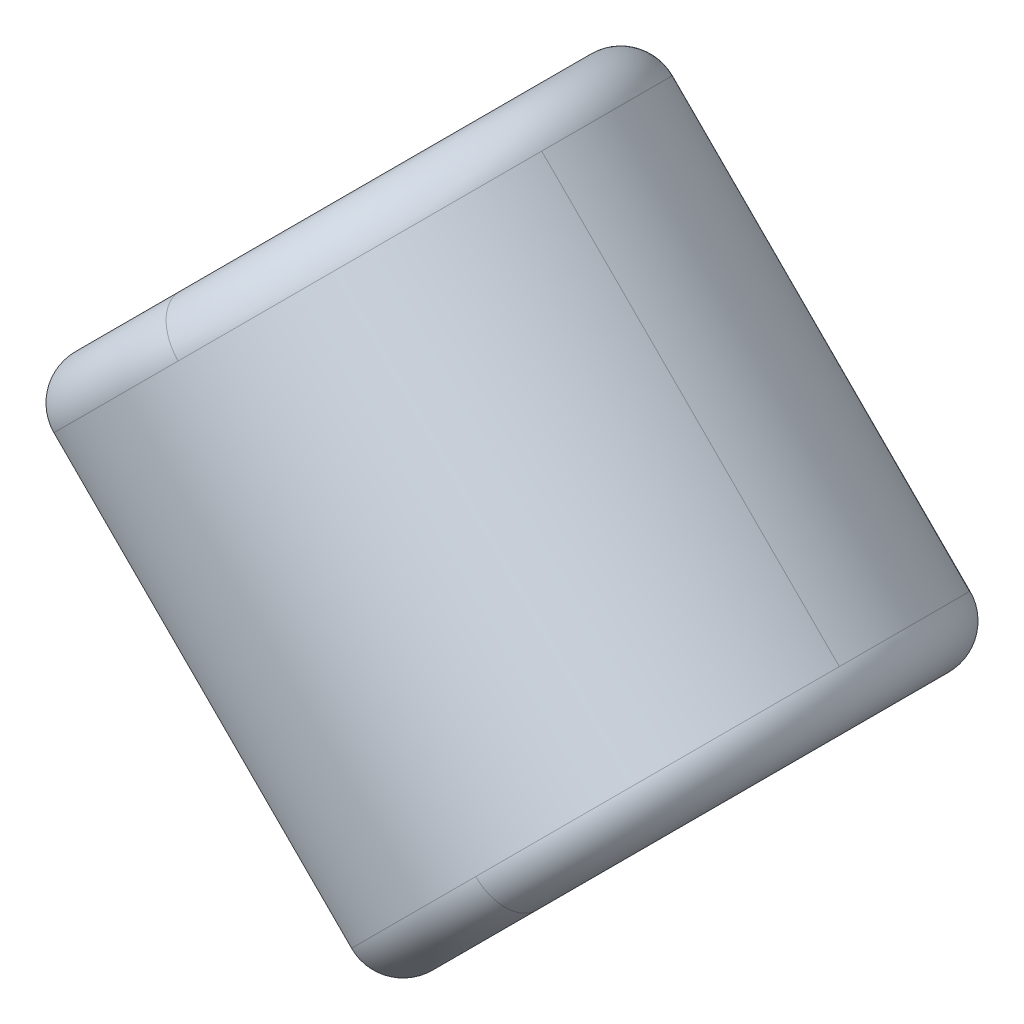
ISO-10303-21;
HEADER;
FILE_DESCRIPTION(('STEP AP214'),'2;1');
FILE_NAME('part.step','',(''),(''),'','','');
FILE_SCHEMA(('AUTOMOTIVE_DESIGN { 1 0 10303 214 1 1 1 1 }'));
ENDSEC;
DATA;
#1=APPLICATION_CONTEXT('core data for automotive mechanical design processes');
#2=APPLICATION_PROTOCOL_DEFINITION('international standard','automotive_design',2000,#1);
#3=PRODUCT_CONTEXT('',#1,'mechanical');
#4=PRODUCT('Part','Part','',(#3));
#5=PRODUCT_RELATED_PRODUCT_CATEGORY('part','',(#4));
#6=PRODUCT_DEFINITION_FORMATION('','',#4);
#7=PRODUCT_DEFINITION_CONTEXT('part definition',#1,'design');
#8=PRODUCT_DEFINITION('design','',#6,#7);
#9=PRODUCT_DEFINITION_SHAPE('','',#8);
#10=(LENGTH_UNIT() NAMED_UNIT(*) SI_UNIT(.MILLI.,.METRE.));
#11=(NAMED_UNIT(*) PLANE_ANGLE_UNIT() SI_UNIT($,.RADIAN.));
#12=(NAMED_UNIT(*) SI_UNIT($,.STERADIAN.) SOLID_ANGLE_UNIT());
#13=UNCERTAINTY_MEASURE_WITH_UNIT(LENGTH_MEASURE(1.E-05),#10,'distance_accuracy_value','');
#14=(GEOMETRIC_REPRESENTATION_CONTEXT(3) GLOBAL_UNCERTAINTY_ASSIGNED_CONTEXT((#13)) GLOBAL_UNIT_ASSIGNED_CONTEXT((#10,
#11,#12)) REPRESENTATION_CONTEXT('',''));
#15=CARTESIAN_POINT('',(0.,0.,0.));
#16=DIRECTION('',(0.,0.,1.));
#17=DIRECTION('',(1.,0.,0.));
#18=AXIS2_PLACEMENT_3D('',#15,#16,#17);
#19=CARTESIAN_POINT('',(10.1213203435599,45.8786796564401,0.));
#20=DIRECTION('',(-0.707106781186514,0.707106781186581,0.));
#21=DIRECTION('',(-0.707106781186581,-0.707106781186514,0.));
#22=AXIS2_PLACEMENT_3D('',#19,#20,#21);
#23=PLANE('',#22);
#24=CARTESIAN_POINT('',(10.6675903741209,46.4249496870014,2.37764129073849));
#25=CARTESIAN_POINT('',(10.6950999194314,46.4524592323118,2.36500140635933));
#26=CARTESIAN_POINT('',(10.7223896631904,46.4797489760709,2.35140507426622));
#27=CARTESIAN_POINT('',(10.7764647625539,46.5338240754343,2.32233583487643));
#28=CARTESIAN_POINT('',(10.8032501181583,46.5606094310388,2.30686292757975));
#29=CARTESIAN_POINT('',(10.8562516561607,46.6136109690412,2.2740768580071));
#30=CARTESIAN_POINT('',(10.8824678385587,46.6398271514391,2.25676369573114));
#31=CARTESIAN_POINT('',(10.9342679418736,46.6916272547541,2.22033908111349));
#32=CARTESIAN_POINT('',(10.9598518627906,46.717211175671,2.20122762877181));
#33=CARTESIAN_POINT('',(11.0103257908008,46.7676851036813,2.16125240659329));
#34=CARTESIAN_POINT('',(11.0352157978941,46.7925751107745,2.14038863675645));
#35=CARTESIAN_POINT('',(11.0842419409898,46.8416012538702,2.0969590606158));
#36=CARTESIAN_POINT('',(11.1083780769922,46.8657373898726,2.07439325431199));
#37=CARTESIAN_POINT('',(11.1558383305167,46.9131976433971,2.02761396331662));
#38=CARTESIAN_POINT('',(11.1791624480389,46.9365217609193,2.00340047862506));
#39=CARTESIAN_POINT('',(11.2249424751155,46.9823017879959,1.95338416457924));
#40=CARTESIAN_POINT('',(11.24739838467,47.0047576975504,1.92758133522498));
#41=CARTESIAN_POINT('',(11.2913878974633,47.0487472103437,1.87444849277614));
#42=CARTESIAN_POINT('',(11.3129215007022,47.0702808135825,1.84711847968157));
#43=CARTESIAN_POINT('',(11.3550145245532,47.1123738374336,1.79099711024223));
#44=CARTESIAN_POINT('',(11.3755739451655,47.1329332580458,1.76220575389746));
#45=CARTESIAN_POINT('',(11.4156690743115,47.1730283871919,1.7032310588316));
#46=CARTESIAN_POINT('',(11.4352047828454,47.1925640957257,1.67304772011051));
#47=CARTESIAN_POINT('',(11.4732054246034,47.2305647374838,1.61136177460553));
#48=CARTESIAN_POINT('',(11.4916703578276,47.249029670708,1.57985916782165));
#49=CARTESIAN_POINT('',(11.5274849653246,47.2848442782049,1.51561057872831));
#50=CARTESIAN_POINT('',(11.5448346395973,47.3021939524776,1.48286459641885));
#51=CARTESIAN_POINT('',(11.5783769323063,47.3357362451866,1.41620814421445));
#52=CARTESIAN_POINT('',(11.5945695507426,47.3519288636229,1.38229767431951));
#53=CARTESIAN_POINT('',(11.6257587223426,47.383118035223,1.31339394023618));
#54=CARTESIAN_POINT('',(11.6407552755064,47.3981145883867,1.2784006760478));
#55=CARTESIAN_POINT('',(11.6695161885512,47.4268755014316,1.20741565521611));
#56=CARTESIAN_POINT('',(11.6832805484323,47.4406398613127,1.1714238985728));
#57=CARTESIAN_POINT('',(11.7095439153633,47.4669032282437,1.09852860012551));
#58=CARTESIAN_POINT('',(11.7220429224132,47.4794022352936,1.06162505832153));
#59=CARTESIAN_POINT('',(11.745745472479,47.5031047853594,0.986995093417465));
#60=CARTESIAN_POINT('',(11.7569490154949,47.5143083283753,0.949268670317386));
#61=CARTESIAN_POINT('',(11.7780336471763,47.5353929600566,0.87308382907882));
#62=CARTESIAN_POINT('',(11.7879147358417,47.5452740487221,0.834625410940335));
#63=CARTESIAN_POINT('',(11.8063306544142,47.5636899672945,0.757069229322813));
#64=CARTESIAN_POINT('',(11.8148654843211,47.5722247972015,0.717971465843776));
#65=CARTESIAN_POINT('',(11.8305683242237,47.5879276371041,0.639230783481934));
#66=CARTESIAN_POINT('',(11.8377363342194,47.5950956470997,0.599587864599127));
#67=CARTESIAN_POINT('',(11.8506882659355,47.6080475788158,0.519852374693643));
#68=CARTESIAN_POINT('',(11.8564721876559,47.6138315005362,0.479759803670964));
#69=CARTESIAN_POINT('',(11.8666420088475,47.6240013217278,0.399221596001024));
#70=CARTESIAN_POINT('',(11.8710279083186,47.6283872211989,0.358775959353762));
#71=CARTESIAN_POINT('',(11.8783911189956,47.635750431876,0.277629057515958));
#72=CARTESIAN_POINT('',(11.8813684302015,47.6387277430819,0.236927792325415));
#73=CARTESIAN_POINT('',(11.8859072917446,47.6432666046249,0.155367686313902));
#74=CARTESIAN_POINT('',(11.8874688420817,47.644828154962,0.114508845492931));
#75=CARTESIAN_POINT('',(11.8891724199757,47.6465317328561,0.0327320207469131));
#76=CARTESIAN_POINT('',(11.8893144475326,47.646673760413,-0.00818596317813482));
#77=CARTESIAN_POINT('',(11.8881786377093,47.6455379505896,-0.0899824991250407));
#78=CARTESIAN_POINT('',(11.8869008003291,47.6442601132094,-0.130861051146899));
#79=CARTESIAN_POINT('',(11.8829283390537,47.6402876519341,-0.212480243275066));
#80=CARTESIAN_POINT('',(11.8802337151586,47.6375930280389,-0.253220883381376));
#81=CARTESIAN_POINT('',(11.8734341724384,47.6307934853187,-0.334466103907972));
#82=CARTESIAN_POINT('',(11.8693292536133,47.6266885664936,-0.374970684328258));
#83=CARTESIAN_POINT('',(11.8597190101422,47.6170783230226,-0.455646206400791));
#84=CARTESIAN_POINT('',(11.8542136854962,47.6115729983765,-0.495817148053039));
#85=CARTESIAN_POINT('',(11.8418158931925,47.5991752060729,-0.575728617272498));
#86=CARTESIAN_POINT('',(11.8349234255349,47.5922827384152,-0.615469144839709));
#87=CARTESIAN_POINT('',(11.8197679517661,47.5771272646465,-0.694424047477323));
#88=CARTESIAN_POINT('',(11.8115049456551,47.5688642585355,-0.733638422547727));
#89=CARTESIAN_POINT('',(11.7936283012852,47.5509876141655,-0.811446549327413));
#90=CARTESIAN_POINT('',(11.7840146630262,47.5413739759066,-0.850040301036694));
#91=CARTESIAN_POINT('',(11.7634599144571,47.5208192273375,-0.92651420536585));
#92=CARTESIAN_POINT('',(11.752518804147,47.5098781170273,-0.964394357985725));
#93=CARTESIAN_POINT('',(11.7293354695684,47.4866947824487,-1.0393498075305));
#94=CARTESIAN_POINT('',(11.7170932453,47.4744525581804,-1.0764251044554));
#95=CARTESIAN_POINT('',(11.6913371753956,47.4486964882759,-1.14968152497252));
#96=CARTESIAN_POINT('',(11.6778233297596,47.4351826426399,-1.18586264856474));
#97=CARTESIAN_POINT('',(11.6495565731577,47.406915886038,-1.25724355892067));
#98=CARTESIAN_POINT('',(11.6348036621918,47.3921629750721,-1.29244334568438));
#99=CARTESIAN_POINT('',(11.6040943159849,47.3614536288653,-1.36177678301385));
#100=CARTESIAN_POINT('',(11.588137880744,47.3454971936243,-1.39591043357961));
#101=CARTESIAN_POINT('',(11.555059926437,47.3124192393174,-1.46302936755919));
#102=CARTESIAN_POINT('',(11.537938407371,47.2952977202514,-1.49601465097302));
#103=CARTESIAN_POINT('',(11.5025715326531,47.2599308455335,-1.56075738621185));
#104=CARTESIAN_POINT('',(11.4843261770013,47.2416854898816,-1.59251483803684));
#105=CARTESIAN_POINT('',(11.4467555837715,47.2041148966518,-1.65472540361492));
#106=CARTESIAN_POINT('',(11.4274303461935,47.1847896590739,-1.685178517368));
#107=CARTESIAN_POINT('',(11.3877465453017,47.1451058581821,-1.74470704258385));
#108=CARTESIAN_POINT('',(11.3673879819877,47.1247472948681,-1.77378245404661));
#109=CARTESIAN_POINT('',(11.3256865751861,47.0830458880665,-1.83048552946891));
#110=CARTESIAN_POINT('',(11.3043437316983,47.0617030445787,-1.85811319342844));
#111=CARTESIAN_POINT('',(11.2607251813284,47.0180844942088,-1.91185421638188));
#112=CARTESIAN_POINT('',(11.2384494744463,46.9958087873267,-1.9379675753758));
#113=CARTESIAN_POINT('',(11.1930188614166,46.950378174297,-1.98861707902894));
#114=CARTESIAN_POINT('',(11.169863955269,46.9272232681494,-2.01315322368816));
#115=CARTESIAN_POINT('',(11.1227307259055,46.8800900387859,-2.06058918895033));
#116=CARTESIAN_POINT('',(11.0987524026895,46.8561117155699,-2.08348900955327));
#117=CARTESIAN_POINT('',(11.0500301050701,46.8073894179505,-2.12759715902924));
#118=CARTESIAN_POINT('',(11.0252861306666,46.7826454435471,-2.14880548790228));
#119=CARTESIAN_POINT('',(10.9750921410739,46.7324514539543,-2.18947956119656));
#120=CARTESIAN_POINT('',(10.9496421258846,46.707001438765,-2.2089453056178));
#121=CARTESIAN_POINT('',(10.8980973660359,46.6554566789163,-2.24608731532518));
#122=CARTESIAN_POINT('',(10.8720026213765,46.6293619342569,-2.26376358061133));
#123=CARTESIAN_POINT('',(10.8192312671131,46.5765905799935,-2.29728404837718));
#124=CARTESIAN_POINT('',(10.7925546575091,46.5499139703896,-2.3131282508569));
#125=CARTESIAN_POINT('',(10.7386838396457,46.4960431525262,-2.34294642293831));
#126=CARTESIAN_POINT('',(10.7114896313863,46.4688489442667,-2.35692039254001));
#127=CARTESIAN_POINT('',(10.6566491294416,46.414008442322,-2.38296443434876));
#128=CARTESIAN_POINT('',(10.6290028357563,46.3863621486368,-2.39503450655582));
#129=CARTESIAN_POINT('',(10.573324765303,46.3306840781835,-2.41724167571365));
#130=CARTESIAN_POINT('',(10.545292988535,46.3026523014155,-2.42737877266441));
#131=CARTESIAN_POINT('',(10.4889114829215,46.2462707958019,-2.44569557015706));
#132=CARTESIAN_POINT('',(10.4605617540759,46.2179210669564,-2.45387527069895));
#133=CARTESIAN_POINT('',(10.4036126412885,46.160971954169,-2.46825756975177));
#134=CARTESIAN_POINT('',(10.3750132573466,46.1323725702271,-2.4744601682627));
#135=CARTESIAN_POINT('',(10.3176337327826,46.074993045663,-2.4848733206767));
#136=CARTESIAN_POINT('',(10.2888535921603,46.0462129050408,-2.48908387457979));
#137=CARTESIAN_POINT('',(10.2311818881338,45.9885412010143,-2.49550279408713));
#138=CARTESIAN_POINT('',(10.2022903247296,45.9596496376101,-2.4977111596914));
#139=CARTESIAN_POINT('',(10.1444653773759,45.9018246902564,-2.50012038281999));
#140=CARTESIAN_POINT('',(10.1155319934264,45.8728913063069,-2.50032124034432));
#141=CARTESIAN_POINT('',(10.0576931082999,45.8150524211804,-2.49871496206729));
#142=CARTESIAN_POINT('',(10.0287876071228,45.7861469200034,-2.49690782626593));
#143=CARTESIAN_POINT('',(9.97107412244947,45.72843343533,-2.49128991997042));
#144=CARTESIAN_POINT('',(9.94226613895312,45.6996254518336,-2.48747914947628));
#145=CARTESIAN_POINT('',(9.88481709423895,45.6421764071195,-2.47786313529963));
#146=CARTESIAN_POINT('',(9.85617603302113,45.6135353459017,-2.47205789161713));
#147=CARTESIAN_POINT('',(9.79912981809571,45.5564891309762,-2.45846698722168));
#148=CARTESIAN_POINT('',(9.77072466438811,45.5280839772686,-2.45068132650873));
#149=CARTESIAN_POINT('',(9.71421874571791,45.4715780585985,-2.43314808009688));
#150=CARTESIAN_POINT('',(9.68611798075531,45.4434772936359,-2.42340049439799));
#151=CARTESIAN_POINT('',(9.63028834744665,45.3876476603272,-2.40196786716098));
#152=CARTESIAN_POINT('',(9.60255947910058,45.3599187919811,-2.39028282562286));
#153=CARTESIAN_POINT('',(9.57505031299854,45.3324096258791,-2.37764129073849));
#154=B_SPLINE_CURVE_WITH_KNOTS('',3,(#24,#25,#26,#27,#28,#29,#30,#31,#32,#33,#34,#35,#36,#37,
#38,#39,#40,#41,#42,#43,#44,#45,#46,#47,#48,#49,#50,#51,#52,#53,#54,#55,#56,#57,#58,#59,#60,#61,
#62,#63,#64,#65,#66,#67,#68,#69,#70,#71,#72,#73,#74,#75,#76,#77,#78,#79,#80,#81,#82,#83,#84,#85,
#86,#87,#88,#89,#90,#91,#92,#93,#94,#95,#96,#97,#98,#99,#100,#101,#102,#103,#104,#105,#106,#107,
#108,#109,#110,#111,#112,#113,#114,#115,#116,#117,#118,#119,#120,#121,#122,#123,#124,#125,#126,
#127,#128,#129,#130,#131,#132,#133,#134,#135,#136,#137,#138,#139,#140,#141,#142,#143,#144,#145,
#146,#147,#148,#149,#150,#151,#152,#153),.UNSPECIFIED.,.F.,.F.,(4,2,2,2,2,2,2,2,2,2,2,2,2,2,2,2,
2,2,2,2,2,2,2,2,2,2,2,2,2,2,2,2,2,2,2,2,2,2,2,2,2,2,2,2,2,2,2,2,2,2,2,2,2,2,2,2,2,2,2,2,2,2,2,2,
4),(0.,0.122706142614595,0.245412285229188,0.36811842784378,0.490824570458373,0.613530713072967,
0.736236855687557,0.858942998302152,0.981649140916746,1.10435528353134,1.22706142614593,
1.34976756876052,1.47247371137511,1.59517985398971,1.7178859966043,1.84059213921889,
1.96329828183349,2.08600442444808,2.20871056706267,2.33141670967727,2.45412285229186,
2.57682899490645,2.69953513752104,2.82224128013564,2.94494742275023,3.06765356536482,
3.19035970797941,3.31306585059401,3.4357719932086,3.55847813582319,3.68118427843779,
3.80389042105238,3.92659656366697,4.04930270628156,4.17200884889616,4.29471499151075,
4.41742113412534,4.54012727673994,4.66283341935453,4.78553956196912,4.90824570458372,
5.03095184719831,5.1536579898129,5.27636413242749,5.39907027504209,5.52177641765668,
5.64448256027127,5.76718870288586,5.88989484550046,6.01260098811505,6.13530713072965,
6.25801327334424,6.38071941595883,6.50342555857342,6.62613170118802,6.74883784380261,
6.8715439864172,6.99425012903179,7.11695627164639,7.23966241426098,7.36236855687557,
7.48507469949016,7.60778084210476,7.73048698471935,7.85319312733394),.UNSPECIFIED.);
#155=CARTESIAN_POINT('',(10.6675903741209,46.4249496870014,2.37764129073849));
#156=VERTEX_POINT('',#155);
#157=CARTESIAN_POINT('',(9.57505031299854,45.3324096258791,-2.37764129073849));
#158=VERTEX_POINT('',#157);
#159=EDGE_CURVE('E11',#156,#158,#154,.T.);
#160=ORIENTED_EDGE('',*,*,#159,.F.);
#161=CARTESIAN_POINT('',(9.57505031299854,45.3324096258791,-2.37764129073849));
#162=CARTESIAN_POINT('',(9.54754076768811,45.3049000805687,-2.36500140635933));
#163=CARTESIAN_POINT('',(9.52025102392906,45.2776103368096,-2.35140507426622));
#164=CARTESIAN_POINT('',(9.46617592456559,45.2235352374461,-2.32233583487643));
#165=CARTESIAN_POINT('',(9.43939056896116,45.1967498818417,-2.30686292757975));
#166=CARTESIAN_POINT('',(9.38638903095874,45.1437483438393,-2.2740768580071));
#167=CARTESIAN_POINT('',(9.36017284856076,45.1175321614413,-2.25676369573114));
#168=CARTESIAN_POINT('',(9.30837274524582,45.0657320581264,-2.22033908111349));
#169=CARTESIAN_POINT('',(9.28278882432887,45.0401481372095,-2.20122762877181));
#170=CARTESIAN_POINT('',(9.23231489631864,44.9896742091992,-2.16125240659329));
#171=CARTESIAN_POINT('',(9.20742488922536,44.9647842021059,-2.14038863675645));
#172=CARTESIAN_POINT('',(9.15839874612968,44.9157580590103,-2.0969590606158));
#173=CARTESIAN_POINT('',(9.13426261012728,44.8916219230079,-2.07439325431199));
#174=CARTESIAN_POINT('',(9.08680235660273,44.8441616694833,-2.02761396331662));
#175=CARTESIAN_POINT('',(9.06347823908059,44.8208375519612,-2.00340047862507));
#176=CARTESIAN_POINT('',(9.01769821200394,44.7750575248845,-1.95338416457925));
#177=CARTESIAN_POINT('',(8.99524230244943,44.75260161533,-1.92758133522498));
#178=CARTESIAN_POINT('',(8.95125278965613,44.7086121025367,-1.87444849277614));
#179=CARTESIAN_POINT('',(8.92971918641732,44.6870784992979,-1.84711847968157));
#180=CARTESIAN_POINT('',(8.88762616256626,44.6449854754469,-1.79099711024223));
#181=CARTESIAN_POINT('',(8.86706674195401,44.6244260548346,-1.76220575389746));
#182=CARTESIAN_POINT('',(8.82697161280794,44.5843309256886,-1.7032310588316));
#183=CARTESIAN_POINT('',(8.80743590427412,44.5647952171548,-1.67304772011051));
#184=CARTESIAN_POINT('',(8.76943526251606,44.5267945753967,-1.61136177460553));
#185=CARTESIAN_POINT('',(8.75097032929182,44.5083296421725,-1.57985916782165));
#186=CARTESIAN_POINT('',(8.71515572179489,44.4725150346755,-1.51561057872831));
#187=CARTESIAN_POINT('',(8.6978060475222,44.4551653604028,-1.48286459641885));
#188=CARTESIAN_POINT('',(8.66426375481321,44.4216230676938,-1.41620814421445));
#189=CARTESIAN_POINT('',(8.64807113637691,44.4054304492576,-1.38229767431951));
#190=CARTESIAN_POINT('',(8.61688196477685,44.3742412776575,-1.31339394023618));
#191=CARTESIAN_POINT('',(8.60188541161309,44.3592447244937,-1.2784006760478));
#192=CARTESIAN_POINT('',(8.57312449856823,44.3304838114489,-1.20741565521611));
#193=CARTESIAN_POINT('',(8.55936013868712,44.3167194515678,-1.1714238985728));
#194=CARTESIAN_POINT('',(8.53309677175613,44.2904560846368,-1.09852860012551));
#195=CARTESIAN_POINT('',(8.52059776470625,44.2779570775869,-1.06162505832153));
#196=CARTESIAN_POINT('',(8.49689521464047,44.2542545275211,-0.986995093417468));
#197=CARTESIAN_POINT('',(8.48569167162457,44.2430509845052,-0.949268670317388));
#198=CARTESIAN_POINT('',(8.46460703994321,44.2219663528239,-0.873083829078823));
#199=CARTESIAN_POINT('',(8.45472595127774,44.2120852641584,-0.834625410940337));
#200=CARTESIAN_POINT('',(8.4363100327053,44.193669345586,-0.757069229322815));
#201=CARTESIAN_POINT('',(8.42777520279834,44.185134515679,-0.717971465843779));
#202=CARTESIAN_POINT('',(8.41207236289572,44.1694316757764,-0.639230783481936));
#203=CARTESIAN_POINT('',(8.40490435290007,44.1622636657807,-0.59958786459913));
#204=CARTESIAN_POINT('',(8.391952421184,44.1493117340647,-0.519852374693646));
#205=CARTESIAN_POINT('',(8.38616849946358,44.1435278123442,-0.479759803670968));
#206=CARTESIAN_POINT('',(8.37599867827202,44.1333579911527,-0.399221596001028));
#207=CARTESIAN_POINT('',(8.37161277880087,44.1289720916815,-0.358775959353766));
#208=CARTESIAN_POINT('',(8.36424956812384,44.1216088810045,-0.277629057515962));
#209=CARTESIAN_POINT('',(8.36127225691795,44.1186315697986,-0.236927792325419));
#210=CARTESIAN_POINT('',(8.35673339537491,44.1140927082556,-0.155367686313905));
#211=CARTESIAN_POINT('',(8.35517184503776,44.1125311579184,-0.114508845492934));
#212=CARTESIAN_POINT('',(8.35346826714372,44.1108275800244,-0.0327320207469161));
#213=CARTESIAN_POINT('',(8.35332623958684,44.1106855524675,0.00818596317813143));
#214=CARTESIAN_POINT('',(8.35446204941017,44.1118213622908,0.0899824991250369));
#215=CARTESIAN_POINT('',(8.35573988679038,44.1130991996711,0.130861051146895));
#216=CARTESIAN_POINT('',(8.35971234806574,44.1170716609464,0.212480243275062));
#217=CARTESIAN_POINT('',(8.36240697196087,44.1197662848415,0.253220883381372));
#218=CARTESIAN_POINT('',(8.36920651468108,44.1265658275618,0.334466103907967));
#219=CARTESIAN_POINT('',(8.37331143350616,44.1306707463868,0.374970684328253));
#220=CARTESIAN_POINT('',(8.38292167697725,44.1402809898579,0.455646206400787));
#221=CARTESIAN_POINT('',(8.38842700162326,44.1457863145039,0.495817148053035));
#222=CARTESIAN_POINT('',(8.40082479392694,44.1581841068076,0.575728617272493));
#223=CARTESIAN_POINT('',(8.40771726158462,44.1650765744653,0.615469144839704));
#224=CARTESIAN_POINT('',(8.42287273535332,44.180232048234,0.694424047477319));
#225=CARTESIAN_POINT('',(8.43113574146435,44.188495054345,0.733638422547723));
#226=CARTESIAN_POINT('',(8.44901238583431,44.206371698715,0.811446549327408));
#227=CARTESIAN_POINT('',(8.45862602409323,44.2159853369739,0.850040301036689));
#228=CARTESIAN_POINT('',(8.47918077266233,44.236540085543,0.926514205365845));
#229=CARTESIAN_POINT('',(8.49012188297252,44.2474811958532,0.96439435798572));
#230=CARTESIAN_POINT('',(8.51330521755109,44.2706645304317,1.0393498075305));
#231=CARTESIAN_POINT('',(8.52554744181947,44.2829067547001,1.0764251044554));
#232=CARTESIAN_POINT('',(8.55130351172389,44.3086628246045,1.14968152497251));
#233=CARTESIAN_POINT('',(8.56481735735992,44.3221766702406,1.18586264856473));
#234=CARTESIAN_POINT('',(8.59308411396181,44.3504434268425,1.25724355892067));
#235=CARTESIAN_POINT('',(8.60783702492768,44.3651963378083,1.29244334568438));
#236=CARTESIAN_POINT('',(8.63854637113452,44.3959056840152,1.36177678301385));
#237=CARTESIAN_POINT('',(8.6545028063755,44.4118621192561,1.3959104335796));
#238=CARTESIAN_POINT('',(8.68758076068247,44.4449400735631,1.46302936755919));
#239=CARTESIAN_POINT('',(8.70470227974845,44.4620615926291,1.49601465097302));
#240=CARTESIAN_POINT('',(8.74006915446632,44.4974284673469,1.56075738621184));
#241=CARTESIAN_POINT('',(8.75831451011821,44.5156738229988,1.59251483803684));
#242=CARTESIAN_POINT('',(8.79588510334801,44.5532444162286,1.65472540361491));
#243=CARTESIAN_POINT('',(8.81521034092593,44.5725696538066,1.68517851736799));
#244=CARTESIAN_POINT('',(8.85489414181779,44.6122534546984,1.74470704258384));
#245=CARTESIAN_POINT('',(8.87525270513173,44.6326120180124,1.77378245404661));
#246=CARTESIAN_POINT('',(8.9169541119334,44.674313424814,1.8304855294689));
#247=CARTESIAN_POINT('',(8.93829695542114,44.6956562683017,1.85811319342843));
#248=CARTESIAN_POINT('',(8.98191550579102,44.7392748186716,1.91185421638188));
#249=CARTESIAN_POINT('',(9.00419121267318,44.7615505255538,1.93796757537579));
#250=CARTESIAN_POINT('',(9.0496218257029,44.8069811385835,1.98861707902893));
#251=CARTESIAN_POINT('',(9.07277673185048,44.8301360447311,2.01315322368816));
#252=CARTESIAN_POINT('',(9.11990996121401,44.8772692740946,2.06058918895033));
#253=CARTESIAN_POINT('',(9.14388828442996,44.9012475973106,2.08348900955327));
#254=CARTESIAN_POINT('',(9.19261058204937,44.94996989493,2.12759715902924));
#255=CARTESIAN_POINT('',(9.21735455645283,44.9747138693334,2.14880548790227));
#256=CARTESIAN_POINT('',(9.26754854604558,45.0249078589262,2.18947956119655));
#257=CARTESIAN_POINT('',(9.29299856123488,45.0503578741155,2.2089453056178));
#258=CARTESIAN_POINT('',(9.34454332108358,45.1019026339642,2.24608731532518));
#259=CARTESIAN_POINT('',(9.37063806574298,45.1279973786236,2.26376358061132));
#260=CARTESIAN_POINT('',(9.42340942000636,45.1807687328869,2.29728404837718));
#261=CARTESIAN_POINT('',(9.45008602961034,45.2074453424909,2.3131282508569));
#262=CARTESIAN_POINT('',(9.50395684747375,45.2613161603543,2.34294642293831));
#263=CARTESIAN_POINT('',(9.53115105573318,45.2885103686137,2.35692039254));
#264=CARTESIAN_POINT('',(9.58599155767788,45.3433508705584,2.38296443434876));
#265=CARTESIAN_POINT('',(9.61363785136315,45.3709971642437,2.39503450655582));
#266=CARTESIAN_POINT('',(9.66931592181642,45.426675234697,2.41724167571365));
#267=CARTESIAN_POINT('',(9.69734769858442,45.454707011465,2.42737877266441));
#268=CARTESIAN_POINT('',(9.75372920419799,45.5110885170785,2.44569557015706));
#269=CARTESIAN_POINT('',(9.78207893304355,45.5394382459241,2.45387527069895));
#270=CARTESIAN_POINT('',(9.83902804583097,45.5963873587115,2.46825756975177));
#271=CARTESIAN_POINT('',(9.86762742977282,45.6249867426533,2.47446016826269));
#272=CARTESIAN_POINT('',(9.9250069543369,45.6823662672174,2.4848733206767));
#273=CARTESIAN_POINT('',(9.95378709495914,45.7111464078396,2.48908387457978));
#274=CARTESIAN_POINT('',(10.0114587989856,45.7688181118661,2.49550279408713));
#275=CARTESIAN_POINT('',(10.0403503623899,45.7977096752704,2.4977111596914));
#276=CARTESIAN_POINT('',(10.0981753097436,45.8555346226241,2.50012038281999));
#277=CARTESIAN_POINT('',(10.1271086936931,45.8844680065736,2.50032124034432));
#278=CARTESIAN_POINT('',(10.1849475788196,45.9423068917001,2.49871496206729));
#279=CARTESIAN_POINT('',(10.2138530799966,45.9712123928771,2.49690782626593));
#280=CARTESIAN_POINT('',(10.27156656467,46.0289258775505,2.49128991997043));
#281=CARTESIAN_POINT('',(10.3003745481663,46.0577338610468,2.48747914947628));
#282=CARTESIAN_POINT('',(10.3578235928805,46.115182905761,2.47786313529963));
#283=CARTESIAN_POINT('',(10.3864646540983,46.1438239669788,2.47205789161713));
#284=CARTESIAN_POINT('',(10.4435108690237,46.2008701819042,2.45846698722168));
#285=CARTESIAN_POINT('',(10.4719160227314,46.2292753356118,2.45068132650873));
#286=CARTESIAN_POINT('',(10.5284219414016,46.285781254282,2.43314808009689));
#287=CARTESIAN_POINT('',(10.5565227063642,46.3138820192446,2.42340049439799));
#288=CARTESIAN_POINT('',(10.6123523396728,46.3697116525533,2.40196786716098));
#289=CARTESIAN_POINT('',(10.6400812080189,46.3974405208993,2.39028282562287));
#290=CARTESIAN_POINT('',(10.6675903741209,46.4249496870014,2.3776412907385));
#291=B_SPLINE_CURVE_WITH_KNOTS('',3,(#161,#162,#163,#164,#165,#166,#167,#168,#169,#170,#171,
#172,#173,#174,#175,#176,#177,#178,#179,#180,#181,#182,#183,#184,#185,#186,#187,#188,#189,#190,
#191,#192,#193,#194,#195,#196,#197,#198,#199,#200,#201,#202,#203,#204,#205,#206,#207,#208,#209,
#210,#211,#212,#213,#214,#215,#216,#217,#218,#219,#220,#221,#222,#223,#224,#225,#226,#227,#228,
#229,#230,#231,#232,#233,#234,#235,#236,#237,#238,#239,#240,#241,#242,#243,#244,#245,#246,#247,
#248,#249,#250,#251,#252,#253,#254,#255,#256,#257,#258,#259,#260,#261,#262,#263,#264,#265,#266,
#267,#268,#269,#270,#271,#272,#273,#274,#275,#276,#277,#278,#279,#280,#281,#282,#283,#284,#285,
#286,#287,#288,#289,#290),.UNSPECIFIED.,.F.,.F.,(4,2,2,2,2,2,2,2,2,2,2,2,2,2,2,2,2,2,2,2,2,2,2,
2,2,2,2,2,2,2,2,2,2,2,2,2,2,2,2,2,2,2,2,2,2,2,2,2,2,2,2,2,2,2,2,2,2,2,2,2,2,2,2,2,4),(0.,
0.122706142614595,0.245412285229188,0.36811842784378,0.490824570458373,0.613530713072966,
0.736236855687557,0.858942998302152,0.981649140916745,1.10435528353134,1.22706142614593,
1.34976756876052,1.47247371137511,1.59517985398971,1.7178859966043,1.84059213921889,
1.96329828183349,2.08600442444808,2.20871056706267,2.33141670967726,2.45412285229186,
2.57682899490645,2.69953513752104,2.82224128013563,2.94494742275023,3.06765356536482,
3.19035970797941,3.313065850594,3.4357719932086,3.55847813582319,3.68118427843778,
3.80389042105238,3.92659656366697,4.04930270628156,4.17200884889615,4.29471499151075,
4.41742113412534,4.54012727673993,4.66283341935453,4.78553956196912,4.90824570458371,
5.0309518471983,5.1536579898129,5.27636413242749,5.39907027504208,5.52177641765667,
5.64448256027127,5.76718870288586,5.88989484550045,6.01260098811505,6.13530713072964,
6.25801327334423,6.38071941595882,6.50342555857341,6.626131701188,6.7488378438026,
6.87154398641719,6.99425012903179,7.11695627164638,7.23966241426097,7.36236855687556,
7.48507469949016,7.60778084210475,7.73048698471934,7.85319312733393),.UNSPECIFIED.);
#292=EDGE_CURVE('E26',#158,#156,#291,.T.);
#293=ORIENTED_EDGE('',*,*,#292,.F.);
#294=EDGE_LOOP('',(#160,#293));
#295=FACE_BOUND('',#294,.T.);
#296=ADVANCED_FACE('F17',(#295),#23,.F.);
#297=CARTESIAN_POINT('',(9.76776695296691,46.2322330470331,0.));
#298=DIRECTION('',(-0.707106781186514,0.707106781186581,0.));
#299=DIRECTION('',(0.672498511963989,0.672498511963926,-0.309016994374947));
#300=AXIS2_PLACEMENT_3D('',#297,#298,#299);
#301=TOROIDAL_SURFACE('',#300,2.50000000000064,0.49999999999939);
#302=CARTESIAN_POINT('',(9.22149692240572,45.685963016472,-2.37764129073849));
#303=DIRECTION('',(-0.672498511963989,-0.672498511963926,0.309016994374947));
#304=DIRECTION('',(-0.218508012225357,-0.218508012223463,-0.951056516295154));
#305=AXIS2_PLACEMENT_3D('',#302,#303,#304);
#306=CIRCLE('',#305,0.49999999999939);
#307=CARTESIAN_POINT('',(9.11224291629317,45.5767090103604,-2.85316954888549));
#308=VERTEX_POINT('',#307);
#309=EDGE_CURVE('E139',#308,#158,#306,.T.);
#310=ORIENTED_EDGE('',*,*,#309,.T.);
#311=ORIENTED_EDGE('',*,*,#292,.T.);
#312=CARTESIAN_POINT('',(10.3140369835281,46.7785030775942,2.37764129073849));
#313=DIRECTION('',(0.672498511963989,0.672498511963926,-0.309016994374947));
#314=DIRECTION('',(0.218508012223481,0.218508012225339,0.951056516295154));
#315=AXIS2_PLACEMENT_3D('',#312,#313,#314);
#316=CIRCLE('',#315,0.49999999999939);
#317=CARTESIAN_POINT('',(10.4232909896397,46.8877570837068,2.85316954888549));
#318=VERTEX_POINT('',#317);
#319=EDGE_CURVE('E135',#318,#156,#316,.T.);
#320=ORIENTED_EDGE('',*,*,#319,.F.);
#321=CARTESIAN_POINT('',(9.76776695296647,46.2322330470336,0.));
#322=DIRECTION('',(-0.707106781186514,0.707106781186581,0.));
#323=DIRECTION('',(-0.707106781186581,-0.707106781186514,0.));
#324=AXIS2_PLACEMENT_3D('',#321,#322,#323);
#325=CIRCLE('',#324,3.);
#326=CARTESIAN_POINT('',(7.64644660940673,44.1109127034741,0.));
#327=VERTEX_POINT('',#326);
#328=EDGE_CURVE('E130',#327,#318,#325,.T.);
#329=ORIENTED_EDGE('',*,*,#328,.F.);
#330=CARTESIAN_POINT('',(9.76776695296647,46.2322330470336,0.));
#331=DIRECTION('',(-0.707106781186514,0.707106781186581,0.));
#332=DIRECTION('',(-0.707106781186581,-0.707106781186514,0.));
#333=AXIS2_PLACEMENT_3D('',#330,#331,#332);
#334=CIRCLE('',#333,3.);
#335=EDGE_CURVE('E125',#308,#327,#334,.T.);
#336=ORIENTED_EDGE('',*,*,#335,.F.);
#337=EDGE_LOOP('',(#310,#311,#320,#329,#336));
#338=FACE_BOUND('',#337,.T.);
#339=ADVANCED_FACE('F146',(#338),#301,.T.);
#340=CARTESIAN_POINT('',(5.8786796564404,50.12132034356,0.));
#341=DIRECTION('',(-0.707106781186514,0.707106781186581,0.));
#342=DIRECTION('',(0.,0.,1.));
#343=AXIS2_PLACEMENT_3D('',#340,#341,#342);
#344=CYLINDRICAL_SURFACE('',#343,3.00000000000005);
#345=DIRECTION('',(-0.707106781186514,0.707106781186581,0.));
#346=VECTOR('',#345,1.);
#347=CARTESIAN_POINT('',(11.8890872965262,48.3535533905932,0.));
#348=LINE('',#347,#346);
#349=CARTESIAN_POINT('',(11.8890872965262,48.3535533905932,0.));
#350=VERTEX_POINT('',#349);
#351=CARTESIAN_POINT('',(8.35355339059355,51.8890872965262,0.));
#352=VERTEX_POINT('',#351);
#353=EDGE_CURVE('E92',#350,#352,#348,.T.);
#354=ORIENTED_EDGE('',*,*,#353,.F.);
#355=CARTESIAN_POINT('',(9.76776695296647,46.2322330470336,0.));
#356=DIRECTION('',(-0.707106781186514,0.707106781186581,0.));
#357=DIRECTION('',(-0.707106781186581,-0.707106781186514,0.));
#358=AXIS2_PLACEMENT_3D('',#355,#356,#357);
#359=CIRCLE('',#358,3.);
#360=EDGE_CURVE('E117',#350,#308,#359,.T.);
#361=ORIENTED_EDGE('',*,*,#360,.T.);
#362=ORIENTED_EDGE('',*,*,#335,.T.);
#363=DIRECTION('',(-0.707106781186514,0.707106781186581,0.));
#364=VECTOR('',#363,1.);
#365=CARTESIAN_POINT('',(7.64644660940667,44.110912703474,0.));
#366=LINE('',#365,#364);
#367=CARTESIAN_POINT('',(4.11091270347401,47.646446609407,0.));
#368=VERTEX_POINT('',#367);
#369=EDGE_CURVE('E113',#327,#368,#366,.T.);
#370=ORIENTED_EDGE('',*,*,#369,.T.);
#371=CARTESIAN_POINT('',(6.23223304703379,49.7677669529666,0.));
#372=DIRECTION('',(-0.707106781186514,0.707106781186581,0.));
#373=DIRECTION('',(-0.707106781186581,-0.707106781186514,0.));
#374=AXIS2_PLACEMENT_3D('',#371,#372,#373);
#375=CIRCLE('',#374,3.00000000000006);
#376=CARTESIAN_POINT('',(5.57670901036054,49.1122429162934,-2.85316954888552));
#377=VERTEX_POINT('',#376);
#378=EDGE_CURVE('E84',#377,#368,#375,.T.);
#379=ORIENTED_EDGE('',*,*,#378,.F.);
#380=CARTESIAN_POINT('',(6.23223304703379,49.7677669529666,0.));
#381=DIRECTION('',(-0.707106781186514,0.707106781186581,0.));
#382=DIRECTION('',(-0.707106781186581,-0.707106781186514,0.));
#383=AXIS2_PLACEMENT_3D('',#380,#381,#382);
#384=CIRCLE('',#383,3.00000000000006);
#385=EDGE_CURVE('E106',#352,#377,#384,.T.);
#386=ORIENTED_EDGE('',*,*,#385,.F.);
#387=EDGE_LOOP('',(#354,#361,#362,#370,#379,#386));
#388=FACE_BOUND('',#387,.T.);
#389=ADVANCED_FACE('F155',(#388),#344,.T.);
#390=CARTESIAN_POINT('',(6.23223304703363,49.7677669529668,0.));
#391=DIRECTION('',(-0.707106781186514,0.707106781186581,0.));
#392=DIRECTION('',(-0.672498511963989,-0.672498511963926,0.309016994374947));
#393=AXIS2_PLACEMENT_3D('',#390,#391,#392);
#394=TOROIDAL_SURFACE('',#393,2.50000000000065,0.499999999999413);
#395=CARTESIAN_POINT('',(5.68596301647244,49.2214969224057,-2.3776412907385));
#396=DIRECTION('',(-0.672498511963985,-0.67249851196393,0.309016994374947));
#397=DIRECTION('',(-0.707106781186519,0.707106781186576,0.));
#398=AXIS2_PLACEMENT_3D('',#395,#396,#397);
#399=CIRCLE('',#398,0.499999999999411);
#400=CARTESIAN_POINT('',(5.33240962587959,49.5750503129985,-2.3776412907385));
#401=VERTEX_POINT('',#400);
#402=EDGE_CURVE('E102',#401,#377,#399,.T.);
#403=ORIENTED_EDGE('',*,*,#402,.F.);
#404=CARTESIAN_POINT('',(5.87867965644079,50.1213203435596,0.));
#405=DIRECTION('',(-0.707106781186514,0.707106781186581,0.));
#406=DIRECTION('',(-0.707106781186581,-0.707106781186514,0.));
#407=AXIS2_PLACEMENT_3D('',#404,#405,#406);
#408=CIRCLE('',#407,2.50000000000047);
#409=CARTESIAN_POINT('',(6.42494968700198,50.6675903741208,2.3776412907385));
#410=VERTEX_POINT('',#409);
#411=EDGE_CURVE('E74',#410,#401,#408,.T.);
#412=ORIENTED_EDGE('',*,*,#411,.F.);
#413=CARTESIAN_POINT('',(6.77850307759482,50.3140369835279,2.3776412907385));
#414=DIRECTION('',(0.672498511963992,0.672498511963923,-0.309016994374947));
#415=DIRECTION('',(-0.707106781186511,0.707106781186584,0.));
#416=AXIS2_PLACEMENT_3D('',#413,#414,#415);
#417=CIRCLE('',#416,0.499999999999416);
#418=CARTESIAN_POINT('',(6.88775708370709,50.4232909896398,2.85316954888552));
#419=VERTEX_POINT('',#418);
#420=EDGE_CURVE('E67',#410,#419,#417,.T.);
#421=ORIENTED_EDGE('',*,*,#420,.T.);
#422=CARTESIAN_POINT('',(6.23223304703379,49.7677669529666,0.));
#423=DIRECTION('',(-0.707106781186514,0.707106781186581,0.));
#424=DIRECTION('',(-0.707106781186581,-0.707106781186514,0.));
#425=AXIS2_PLACEMENT_3D('',#422,#423,#424);
#426=CIRCLE('',#425,3.00000000000006);
#427=EDGE_CURVE('E72',#419,#352,#426,.T.);
#428=ORIENTED_EDGE('',*,*,#427,.T.);
#429=ORIENTED_EDGE('',*,*,#385,.T.);
#430=EDGE_LOOP('',(#403,#412,#421,#428,#429));
#431=FACE_BOUND('',#430,.T.);
#432=ADVANCED_FACE('F69',(#431),#394,.T.);
#433=CARTESIAN_POINT('',(5.8786796564404,50.12132034356,0.));
#434=DIRECTION('',(-0.707106781186514,0.707106781186581,0.));
#435=DIRECTION('',(0.,0.,-1.));
#436=AXIS2_PLACEMENT_3D('',#433,#434,#435);
#437=CYLINDRICAL_SURFACE('',#436,3.00000000000005);
#438=ORIENTED_EDGE('',*,*,#353,.T.);
#439=ORIENTED_EDGE('',*,*,#427,.F.);
#440=CARTESIAN_POINT('',(6.23223304703379,49.7677669529666,0.));
#441=DIRECTION('',(-0.707106781186514,0.707106781186581,0.));
#442=DIRECTION('',(-0.707106781186581,-0.707106781186514,0.));
#443=AXIS2_PLACEMENT_3D('',#440,#441,#442);
#444=CIRCLE('',#443,3.00000000000006);
#445=EDGE_CURVE('E81',#368,#419,#444,.T.);
#446=ORIENTED_EDGE('',*,*,#445,.F.);
#447=ORIENTED_EDGE('',*,*,#369,.F.);
#448=ORIENTED_EDGE('',*,*,#328,.T.);
#449=CARTESIAN_POINT('',(9.76776695296647,46.2322330470336,0.));
#450=DIRECTION('',(-0.707106781186514,0.707106781186581,0.));
#451=DIRECTION('',(-0.707106781186581,-0.707106781186514,0.));
#452=AXIS2_PLACEMENT_3D('',#449,#450,#451);
#453=CIRCLE('',#452,3.);
#454=EDGE_CURVE('E87',#318,#350,#453,.T.);
#455=ORIENTED_EDGE('',*,*,#454,.T.);
#456=EDGE_LOOP('',(#438,#439,#446,#447,#448,#455));
#457=FACE_BOUND('',#456,.T.);
#458=ADVANCED_FACE('F90',(#457),#437,.T.);
#459=CARTESIAN_POINT('',(9.76776695296691,46.2322330470331,0.));
#460=DIRECTION('',(-0.707106781186514,0.707106781186581,0.));
#461=DIRECTION('',(-0.672498511963989,-0.672498511963926,0.309016994374947));
#462=AXIS2_PLACEMENT_3D('',#459,#460,#461);
#463=TOROIDAL_SURFACE('',#462,2.50000000000064,0.49999999999939);
#464=ORIENTED_EDGE('',*,*,#309,.F.);
#465=ORIENTED_EDGE('',*,*,#360,.F.);
#466=ORIENTED_EDGE('',*,*,#454,.F.);
#467=ORIENTED_EDGE('',*,*,#319,.T.);
#468=ORIENTED_EDGE('',*,*,#159,.T.);
#469=EDGE_LOOP('',(#464,#465,#466,#467,#468));
#470=FACE_BOUND('',#469,.T.);
#471=ADVANCED_FACE('F164',(#470),#463,.T.);
#472=CARTESIAN_POINT('',(6.23223304703363,49.7677669529668,0.));
#473=DIRECTION('',(-0.707106781186514,0.707106781186581,0.));
#474=DIRECTION('',(0.672498511963989,0.672498511963926,-0.309016994374947));
#475=AXIS2_PLACEMENT_3D('',#472,#473,#474);
#476=TOROIDAL_SURFACE('',#475,2.50000000000065,0.499999999999413);
#477=ORIENTED_EDGE('',*,*,#402,.T.);
#478=ORIENTED_EDGE('',*,*,#378,.T.);
#479=ORIENTED_EDGE('',*,*,#445,.T.);
#480=ORIENTED_EDGE('',*,*,#420,.F.);
#481=CARTESIAN_POINT('',(5.33240962587947,49.5750503129987,-2.37764129073835));
#482=CARTESIAN_POINT('',(4.98030628102349,49.2229469681428,-2.21581456988914));
#483=CARTESIAN_POINT('',(4.65805616015786,48.9006968472772,-1.92378093409531));
#484=CARTESIAN_POINT('',(4.39825482272332,48.6408955098427,-1.51562809304641));
#485=CARTESIAN_POINT('',(4.0547926030655,48.2974332901849,-0.548265555932554));
#486=CARTESIAN_POINT('',(4.09033058210414,48.3329712692235,0.533042296733471));
#487=CARTESIAN_POINT('',(4.21032812593049,48.4529688130499,1.05533182210909));
#488=CARTESIAN_POINT('',(4.63099796854081,48.8736386556602,1.95966933387226));
#489=CARTESIAN_POINT('',(5.310926670191,49.5535673573103,2.45677776492179));
#490=CARTESIAN_POINT('',(5.69074968280722,49.9333903699265,2.57101948101597));
#491=CARTESIAN_POINT('',(6.0728325527999,50.3154732399191,2.5394079934347));
#492=CARTESIAN_POINT('',(6.42494968700178,50.6675903741209,2.37764129073832));
#493=B_SPLINE_CURVE_WITH_KNOTS('',5,(#481,#482,#483,#484,#485,#486,#487,#488,#489,#490,#491,
#492),.UNSPECIFIED.,.F.,.F.,(6,3,3,6),(0.,1.04719755119661,2.09439510239322,3.14159265358983),.UNSPECIFIED.);
#494=EDGE_CURVE('E185',#401,#410,#493,.T.);
#495=ORIENTED_EDGE('',*,*,#494,.F.);
#496=EDGE_LOOP('',(#477,#478,#479,#480,#495));
#497=FACE_BOUND('',#496,.T.);
#498=ADVANCED_FACE('F83',(#497),#476,.T.);
#499=CARTESIAN_POINT('',(4.11091270347381,48.3535533905932,0.));
#500=DIRECTION('',(0.707106781186514,-0.707106781186581,0.));
#501=DIRECTION('',(0.707106781186581,0.707106781186514,0.));
#502=AXIS2_PLACEMENT_3D('',#499,#500,#501);
#503=PLANE('',#502);
#504=ORIENTED_EDGE('',*,*,#494,.T.);
#505=ORIENTED_EDGE('',*,*,#411,.T.);
#506=EDGE_LOOP('',(#504,#505));
#507=FACE_BOUND('',#506,.T.);
#508=ADVANCED_FACE('F191',(#507),#503,.F.);
#509=CLOSED_SHELL('',(#296,#339,#389,#432,#458,#471,#498,#508));
#510=MANIFOLD_SOLID_BREP('B1',#509);
#511=ADVANCED_BREP_SHAPE_REPRESENTATION('',(#18,#510),#14);
#512=SHAPE_DEFINITION_REPRESENTATION(#9,#511);
ENDSEC;
END-ISO-10303-21;
